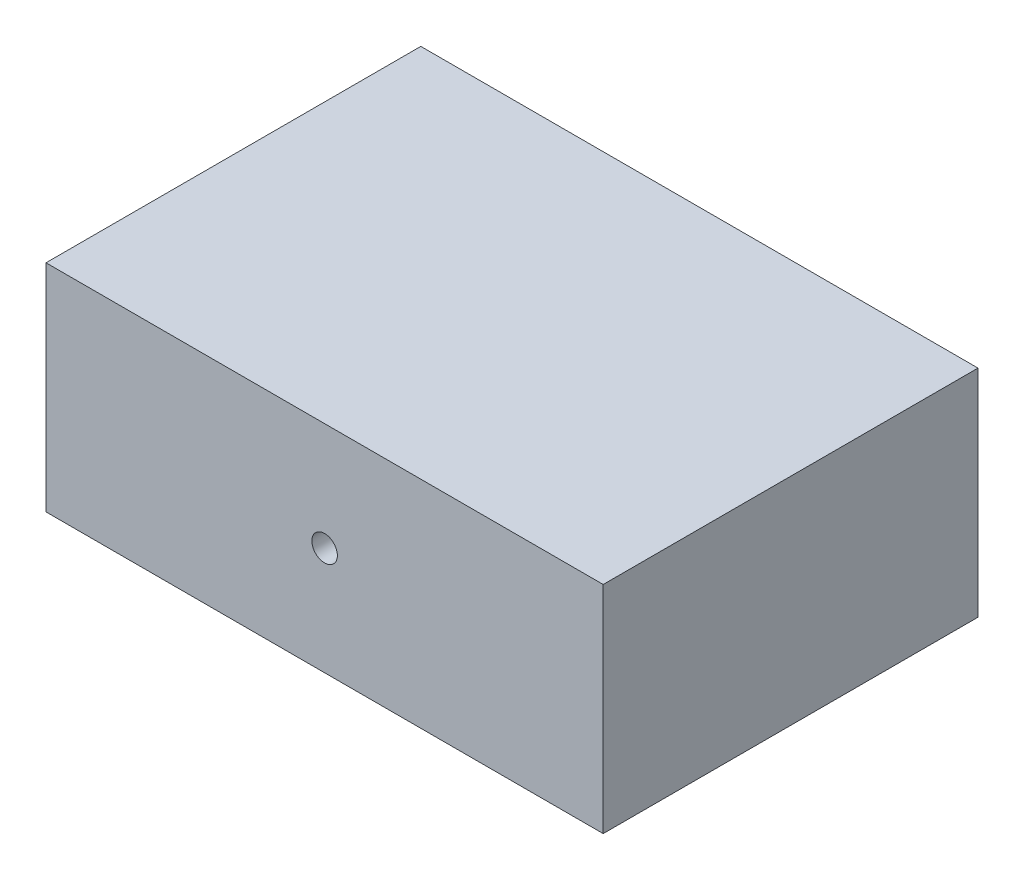
ISO-10303-21;
HEADER;
FILE_DESCRIPTION(('STEP AP214'),'2;1');
FILE_NAME('part.step','',(''),(''),'','','');
FILE_SCHEMA(('AUTOMOTIVE_DESIGN { 1 0 10303 214 1 1 1 1 }'));
ENDSEC;
DATA;
#1=APPLICATION_CONTEXT('core data for automotive mechanical design processes');
#2=APPLICATION_PROTOCOL_DEFINITION('international standard','automotive_design',2000,#1);
#3=PRODUCT_CONTEXT('',#1,'mechanical');
#4=PRODUCT('Part','Part','',(#3));
#5=PRODUCT_RELATED_PRODUCT_CATEGORY('part','',(#4));
#6=PRODUCT_DEFINITION_FORMATION('','',#4);
#7=PRODUCT_DEFINITION_CONTEXT('part definition',#1,'design');
#8=PRODUCT_DEFINITION('design','',#6,#7);
#9=PRODUCT_DEFINITION_SHAPE('','',#8);
#10=(LENGTH_UNIT() NAMED_UNIT(*) SI_UNIT(.MILLI.,.METRE.));
#11=(NAMED_UNIT(*) PLANE_ANGLE_UNIT() SI_UNIT($,.RADIAN.));
#12=(NAMED_UNIT(*) SI_UNIT($,.STERADIAN.) SOLID_ANGLE_UNIT());
#13=UNCERTAINTY_MEASURE_WITH_UNIT(LENGTH_MEASURE(1.E-05),#10,'distance_accuracy_value','');
#14=(GEOMETRIC_REPRESENTATION_CONTEXT(3) GLOBAL_UNCERTAINTY_ASSIGNED_CONTEXT((#13)) GLOBAL_UNIT_ASSIGNED_CONTEXT((#10,
#11,#12)) REPRESENTATION_CONTEXT('',''));
#15=CARTESIAN_POINT('',(0.,0.,0.));
#16=DIRECTION('',(0.,0.,1.));
#17=DIRECTION('',(1.,0.,0.));
#18=AXIS2_PLACEMENT_3D('',#15,#16,#17);
#19=CARTESIAN_POINT('',(0.,43.18,0.));
#20=DIRECTION('',(1.,0.,0.));
#21=DIRECTION('',(0.,0.,-1.));
#22=AXIS2_PLACEMENT_3D('',#19,#20,#21);
#23=PLANE('',#22);
#24=DIRECTION('',(0.,0.,1.));
#25=VECTOR('',#24,1.);
#26=CARTESIAN_POINT('',(0.,0.,0.));
#27=LINE('',#26,#25);
#28=CARTESIAN_POINT('',(0.,0.,-75.0062));
#29=VERTEX_POINT('',#28);
#30=CARTESIAN_POINT('',(0.,0.,0.));
#31=VERTEX_POINT('',#30);
#32=EDGE_CURVE('E103',#29,#31,#27,.T.);
#33=ORIENTED_EDGE('',*,*,#32,.T.);
#34=DIRECTION('',(0.,-1.,0.));
#35=VECTOR('',#34,1.);
#36=CARTESIAN_POINT('',(0.,43.18,0.));
#37=LINE('',#36,#35);
#38=CARTESIAN_POINT('',(0.,43.18,0.));
#39=VERTEX_POINT('',#38);
#40=EDGE_CURVE('E11',#39,#31,#37,.T.);
#41=ORIENTED_EDGE('',*,*,#40,.F.);
#42=DIRECTION('',(0.,0.,1.));
#43=VECTOR('',#42,1.);
#44=CARTESIAN_POINT('',(0.,43.18,0.));
#45=LINE('',#44,#43);
#46=CARTESIAN_POINT('',(0.,43.18,-75.0062));
#47=VERTEX_POINT('',#46);
#48=EDGE_CURVE('E112',#47,#39,#45,.T.);
#49=ORIENTED_EDGE('',*,*,#48,.F.);
#50=DIRECTION('',(0.,-1.,0.));
#51=VECTOR('',#50,1.);
#52=CARTESIAN_POINT('',(0.,43.18,-75.0062));
#53=LINE('',#52,#51);
#54=EDGE_CURVE('E117',#47,#29,#53,.T.);
#55=ORIENTED_EDGE('',*,*,#54,.T.);
#56=EDGE_LOOP('',(#33,#41,#49,#55));
#57=FACE_BOUND('',#56,.T.);
#58=ADVANCED_FACE('F42',(#57),#23,.F.);
#59=CARTESIAN_POINT('',(0.,43.18,0.));
#60=DIRECTION('',(0.,0.,-1.));
#61=DIRECTION('',(-1.,0.,0.));
#62=AXIS2_PLACEMENT_3D('',#59,#60,#61);
#63=PLANE('',#62);
#64=CARTESIAN_POINT('',(55.753,21.59,0.));
#65=DIRECTION('',(0.,0.,1.));
#66=DIRECTION('',(1.,0.,0.));
#67=AXIS2_PLACEMENT_3D('',#64,#65,#66);
#68=CIRCLE('',#67,2.55269999999999);
#69=CARTESIAN_POINT('',(58.3057,21.59,0.));
#70=VERTEX_POINT('',#69);
#71=EDGE_CURVE('E104',#70,#70,#68,.T.);
#72=ORIENTED_EDGE('',*,*,#71,.F.);
#73=EDGE_LOOP('',(#72));
#74=FACE_BOUND('',#73,.T.);
#75=DIRECTION('',(1.,0.,0.));
#76=VECTOR('',#75,1.);
#77=CARTESIAN_POINT('',(0.,0.,0.));
#78=LINE('',#77,#76);
#79=CARTESIAN_POINT('',(111.506,0.,0.));
#80=VERTEX_POINT('',#79);
#81=EDGE_CURVE('E107',#31,#80,#78,.T.);
#82=ORIENTED_EDGE('',*,*,#81,.T.);
#83=DIRECTION('',(0.,-1.,0.));
#84=VECTOR('',#83,1.);
#85=CARTESIAN_POINT('',(111.506,43.18,0.));
#86=LINE('',#85,#84);
#87=CARTESIAN_POINT('',(111.506,43.18,0.));
#88=VERTEX_POINT('',#87);
#89=EDGE_CURVE('E50',#88,#80,#86,.T.);
#90=ORIENTED_EDGE('',*,*,#89,.F.);
#91=DIRECTION('',(1.,0.,0.));
#92=VECTOR('',#91,1.);
#93=CARTESIAN_POINT('',(0.,43.18,0.));
#94=LINE('',#93,#92);
#95=EDGE_CURVE('E89',#39,#88,#94,.T.);
#96=ORIENTED_EDGE('',*,*,#95,.F.);
#97=ORIENTED_EDGE('',*,*,#40,.T.);
#98=EDGE_LOOP('',(#82,#90,#96,#97));
#99=FACE_BOUND('',#98,.T.);
#100=ADVANCED_FACE('F140',(#74,#99),#63,.F.);
#101=CARTESIAN_POINT('',(111.506,43.18,0.));
#102=DIRECTION('',(-1.,0.,0.));
#103=DIRECTION('',(0.,0.,1.));
#104=AXIS2_PLACEMENT_3D('',#101,#102,#103);
#105=PLANE('',#104);
#106=DIRECTION('',(0.,0.,-1.));
#107=VECTOR('',#106,1.);
#108=CARTESIAN_POINT('',(111.506,0.,0.));
#109=LINE('',#108,#107);
#110=CARTESIAN_POINT('',(111.506,0.,-75.0062));
#111=VERTEX_POINT('',#110);
#112=EDGE_CURVE('E76',#80,#111,#109,.T.);
#113=ORIENTED_EDGE('',*,*,#112,.T.);
#114=DIRECTION('',(0.,-1.,0.));
#115=VECTOR('',#114,1.);
#116=CARTESIAN_POINT('',(111.506,43.18,-75.0062));
#117=LINE('',#116,#115);
#118=CARTESIAN_POINT('',(111.506,43.18,-75.0062));
#119=VERTEX_POINT('',#118);
#120=EDGE_CURVE('E123',#119,#111,#117,.T.);
#121=ORIENTED_EDGE('',*,*,#120,.F.);
#122=DIRECTION('',(0.,0.,-1.));
#123=VECTOR('',#122,1.);
#124=CARTESIAN_POINT('',(111.506,43.18,0.));
#125=LINE('',#124,#123);
#126=EDGE_CURVE('E115',#88,#119,#125,.T.);
#127=ORIENTED_EDGE('',*,*,#126,.F.);
#128=ORIENTED_EDGE('',*,*,#89,.T.);
#129=EDGE_LOOP('',(#113,#121,#127,#128));
#130=FACE_BOUND('',#129,.T.);
#131=ADVANCED_FACE('F125',(#130),#105,.F.);
#132=CARTESIAN_POINT('',(0.,43.18,-75.0062));
#133=DIRECTION('',(0.,0.,1.));
#134=DIRECTION('',(1.,0.,0.));
#135=AXIS2_PLACEMENT_3D('',#132,#133,#134);
#136=PLANE('',#135);
#137=DIRECTION('',(-1.,0.,0.));
#138=VECTOR('',#137,1.);
#139=CARTESIAN_POINT('',(0.,0.,-75.0062));
#140=LINE('',#139,#138);
#141=EDGE_CURVE('E82',#111,#29,#140,.T.);
#142=ORIENTED_EDGE('',*,*,#141,.T.);
#143=ORIENTED_EDGE('',*,*,#54,.F.);
#144=DIRECTION('',(-1.,0.,0.));
#145=VECTOR('',#144,1.);
#146=CARTESIAN_POINT('',(0.,43.18,-75.0062));
#147=LINE('',#146,#145);
#148=EDGE_CURVE('E58',#119,#47,#147,.T.);
#149=ORIENTED_EDGE('',*,*,#148,.F.);
#150=ORIENTED_EDGE('',*,*,#120,.T.);
#151=EDGE_LOOP('',(#142,#143,#149,#150));
#152=FACE_BOUND('',#151,.T.);
#153=ADVANCED_FACE('F131',(#152),#136,.F.);
#154=CARTESIAN_POINT('',(0.,43.18,0.));
#155=DIRECTION('',(0.,-1.,0.));
#156=DIRECTION('',(0.,0.,-1.));
#157=AXIS2_PLACEMENT_3D('',#154,#155,#156);
#158=PLANE('',#157);
#159=ORIENTED_EDGE('',*,*,#48,.T.);
#160=ORIENTED_EDGE('',*,*,#95,.T.);
#161=ORIENTED_EDGE('',*,*,#126,.T.);
#162=ORIENTED_EDGE('',*,*,#148,.T.);
#163=EDGE_LOOP('',(#159,#160,#161,#162));
#164=FACE_BOUND('',#163,.T.);
#165=ADVANCED_FACE('F133',(#164),#158,.F.);
#166=CARTESIAN_POINT('',(0.,0.,0.));
#167=DIRECTION('',(0.,-1.,0.));
#168=DIRECTION('',(0.,0.,-1.));
#169=AXIS2_PLACEMENT_3D('',#166,#167,#168);
#170=PLANE('',#169);
#171=ORIENTED_EDGE('',*,*,#32,.F.);
#172=ORIENTED_EDGE('',*,*,#141,.F.);
#173=ORIENTED_EDGE('',*,*,#112,.F.);
#174=ORIENTED_EDGE('',*,*,#81,.F.);
#175=EDGE_LOOP('',(#171,#172,#173,#174));
#176=FACE_BOUND('',#175,.T.);
#177=ADVANCED_FACE('F97',(#176),#170,.T.);
#178=CARTESIAN_POINT('',(55.753,21.59,-16.51));
#179=DIRECTION('',(0.,0.,1.));
#180=DIRECTION('',(1.,0.,0.));
#181=AXIS2_PLACEMENT_3D('',#178,#179,#180);
#182=CONICAL_SURFACE('',#181,2.55269999999998,1.02974425867665);
#183=CARTESIAN_POINT('',(55.753,21.59,-18.0438169021916));
#184=VERTEX_POINT('',#183);
#185=VERTEX_LOOP('',#184);
#186=FACE_BOUND('',#185,.T.);
#187=CARTESIAN_POINT('',(55.753,21.59,-16.51));
#188=DIRECTION('',(0.,0.,1.));
#189=DIRECTION('',(1.,0.,0.));
#190=AXIS2_PLACEMENT_3D('',#187,#188,#189);
#191=CIRCLE('',#190,2.55269999999998);
#192=CARTESIAN_POINT('',(58.3057,21.59,-16.51));
#193=VERTEX_POINT('',#192);
#194=EDGE_CURVE('E101',#193,#193,#191,.T.);
#195=ORIENTED_EDGE('',*,*,#194,.T.);
#196=EDGE_LOOP('',(#195));
#197=FACE_BOUND('',#196,.T.);
#198=ADVANCED_FACE('F93',(#186,#197),#182,.F.);
#199=CARTESIAN_POINT('',(55.753,21.59,0.));
#200=DIRECTION('',(0.,0.,1.));
#201=DIRECTION('',(1.,0.,0.));
#202=AXIS2_PLACEMENT_3D('',#199,#200,#201);
#203=CYLINDRICAL_SURFACE('',#202,2.55269999999999);
#204=ORIENTED_EDGE('',*,*,#194,.F.);
#205=EDGE_LOOP('',(#204));
#206=FACE_BOUND('',#205,.T.);
#207=ORIENTED_EDGE('',*,*,#71,.T.);
#208=EDGE_LOOP('',(#207));
#209=FACE_BOUND('',#208,.T.);
#210=ADVANCED_FACE('F96',(#206,#209),#203,.F.);
#211=CLOSED_SHELL('',(#58,#100,#131,#153,#165,#177,#198,#210));
#212=MANIFOLD_SOLID_BREP('B2',#211);
#213=ADVANCED_BREP_SHAPE_REPRESENTATION('',(#18,#212),#14);
#214=SHAPE_DEFINITION_REPRESENTATION(#9,#213);
ENDSEC;
END-ISO-10303-21;
